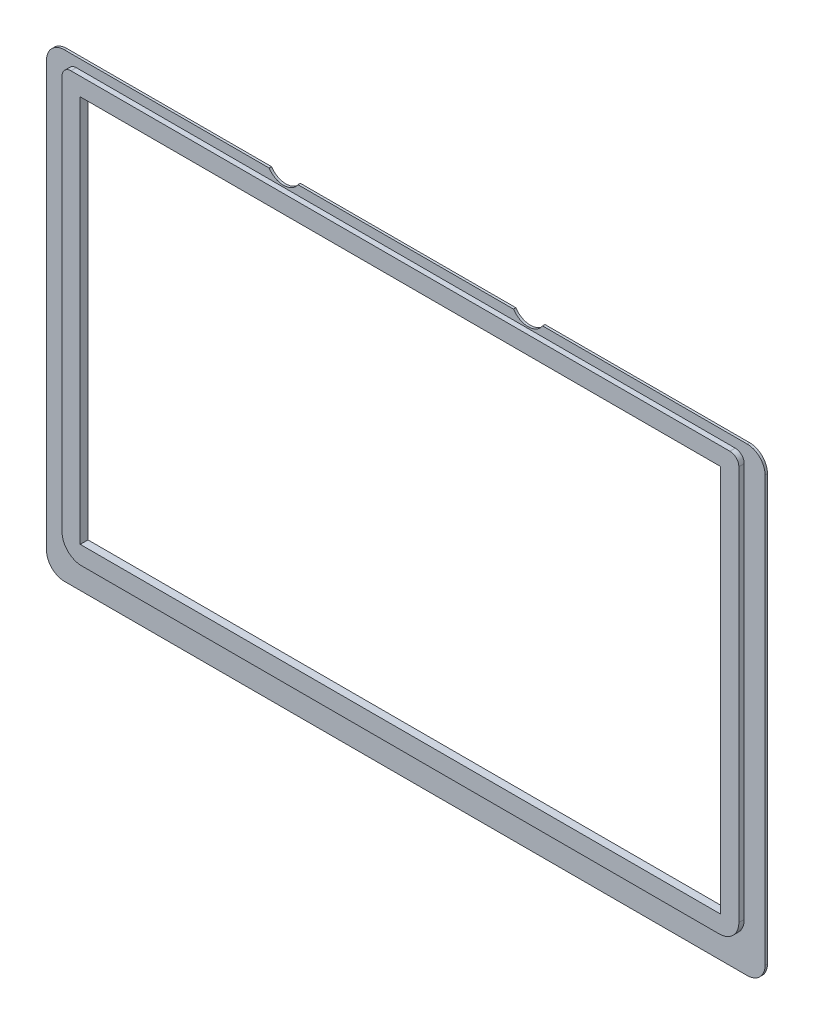
ISO-10303-21;
HEADER;
FILE_DESCRIPTION(('STEP AP214'),'2;1');
FILE_NAME('part.step','',(''),(''),'','','');
FILE_SCHEMA(('AUTOMOTIVE_DESIGN { 1 0 10303 214 1 1 1 1 }'));
ENDSEC;
DATA;
#1=APPLICATION_CONTEXT('core data for automotive mechanical design processes');
#2=APPLICATION_PROTOCOL_DEFINITION('international standard','automotive_design',2000,#1);
#3=PRODUCT_CONTEXT('',#1,'mechanical');
#4=PRODUCT('Part','Part','',(#3));
#5=PRODUCT_RELATED_PRODUCT_CATEGORY('part','',(#4));
#6=PRODUCT_DEFINITION_FORMATION('','',#4);
#7=PRODUCT_DEFINITION_CONTEXT('part definition',#1,'design');
#8=PRODUCT_DEFINITION('design','',#6,#7);
#9=PRODUCT_DEFINITION_SHAPE('','',#8);
#10=(LENGTH_UNIT() NAMED_UNIT(*) SI_UNIT(.MILLI.,.METRE.));
#11=(NAMED_UNIT(*) PLANE_ANGLE_UNIT() SI_UNIT($,.RADIAN.));
#12=(NAMED_UNIT(*) SI_UNIT($,.STERADIAN.) SOLID_ANGLE_UNIT());
#13=UNCERTAINTY_MEASURE_WITH_UNIT(LENGTH_MEASURE(1.E-05),#10,'distance_accuracy_value','');
#14=(GEOMETRIC_REPRESENTATION_CONTEXT(3) GLOBAL_UNCERTAINTY_ASSIGNED_CONTEXT((#13)) GLOBAL_UNIT_ASSIGNED_CONTEXT((#10,
#11,#12)) REPRESENTATION_CONTEXT('',''));
#15=CARTESIAN_POINT('',(0.,0.,0.));
#16=DIRECTION('',(0.,0.,1.));
#17=DIRECTION('',(1.,0.,0.));
#18=AXIS2_PLACEMENT_3D('',#15,#16,#17);
#19=CARTESIAN_POINT('',(60.25,83.5,-124.5086650067));
#20=DIRECTION('',(0.,1.,0.));
#21=DIRECTION('',(0.,0.,1.));
#22=AXIS2_PLACEMENT_3D('',#19,#20,#21);
#23=PLANE('',#22);
#24=DIRECTION('',(0.,0.,1.));
#25=VECTOR('',#24,1.);
#26=CARTESIAN_POINT('',(18.0622953056462,83.5,18.6));
#27=LINE('',#26,#25);
#28=CARTESIAN_POINT('',(18.0622953056462,83.5,18.6));
#29=VERTEX_POINT('',#28);
#30=CARTESIAN_POINT('',(18.0622953056462,83.5,19.));
#31=VERTEX_POINT('',#30);
#32=EDGE_CURVE('E278',#29,#31,#27,.T.);
#33=ORIENTED_EDGE('',*,*,#32,.F.);
#34=DIRECTION('',(1.,0.,0.));
#35=VECTOR('',#34,1.);
#36=CARTESIAN_POINT('',(60.25,83.5,18.6));
#37=LINE('',#36,#35);
#38=CARTESIAN_POINT('',(-18.0813226755104,83.5,18.6));
#39=VERTEX_POINT('',#38);
#40=EDGE_CURVE('E223',#39,#29,#37,.T.);
#41=ORIENTED_EDGE('',*,*,#40,.F.);
#42=DIRECTION('',(0.,0.,1.));
#43=VECTOR('',#42,1.);
#44=CARTESIAN_POINT('',(-18.0813226755104,83.5,18.6));
#45=LINE('',#44,#43);
#46=CARTESIAN_POINT('',(-18.0813226755104,83.5,19.));
#47=VERTEX_POINT('',#46);
#48=EDGE_CURVE('E62',#47,#39,#45,.F.);
#49=ORIENTED_EDGE('',*,*,#48,.F.);
#50=DIRECTION('',(-1.,0.,0.));
#51=VECTOR('',#50,1.);
#52=CARTESIAN_POINT('',(60.25,83.5,19.));
#53=LINE('',#52,#51);
#54=EDGE_CURVE('E249',#31,#47,#53,.T.);
#55=ORIENTED_EDGE('',*,*,#54,.F.);
#56=EDGE_LOOP('',(#33,#41,#49,#55));
#57=FACE_BOUND('',#56,.T.);
#58=ADVANCED_FACE('F39',(#57),#23,.T.);
#59=DIRECTION('',(0.,0.,1.));
#60=VECTOR('',#59,1.);
#61=CARTESIAN_POINT('',(-22.9186773244896,83.5,18.6));
#62=LINE('',#61,#60);
#63=CARTESIAN_POINT('',(-22.9186773244896,83.5,18.6));
#64=VERTEX_POINT('',#63);
#65=CARTESIAN_POINT('',(-22.9186773244896,83.5,19.));
#66=VERTEX_POINT('',#65);
#67=EDGE_CURVE('E200',#64,#66,#62,.T.);
#68=ORIENTED_EDGE('',*,*,#67,.F.);
#69=CARTESIAN_POINT('',(-57.25,83.5,18.6));
#70=VERTEX_POINT('',#69);
#71=EDGE_CURVE('E213',#70,#64,#37,.T.);
#72=ORIENTED_EDGE('',*,*,#71,.F.);
#73=DIRECTION('',(0.,0.,1.));
#74=VECTOR('',#73,1.);
#75=CARTESIAN_POINT('',(-57.25,83.5,-124.5086650067));
#76=LINE('',#75,#74);
#77=CARTESIAN_POINT('',(-57.25,83.5,19.));
#78=VERTEX_POINT('',#77);
#79=EDGE_CURVE('E47',#70,#78,#76,.T.);
#80=ORIENTED_EDGE('',*,*,#79,.T.);
#81=EDGE_CURVE('E215',#66,#78,#53,.T.);
#82=ORIENTED_EDGE('',*,*,#81,.F.);
#83=EDGE_LOOP('',(#68,#72,#80,#82));
#84=FACE_BOUND('',#83,.T.);
#85=ADVANCED_FACE('F211',(#84),#23,.T.);
#86=CARTESIAN_POINT('',(-56.75,10.9,18.6));
#87=DIRECTION('',(-1.,0.,0.));
#88=DIRECTION('',(0.,0.,1.));
#89=AXIS2_PLACEMENT_3D('',#86,#87,#88);
#90=PLANE('',#89);
#91=DIRECTION('',(0.,-1.,0.));
#92=VECTOR('',#91,1.);
#93=CARTESIAN_POINT('',(-56.75,10.9,19.));
#94=LINE('',#93,#92);
#95=CARTESIAN_POINT('',(-56.75,80.4,19.));
#96=VERTEX_POINT('',#95);
#97=CARTESIAN_POINT('',(-56.75,14.2,19.));
#98=VERTEX_POINT('',#97);
#99=EDGE_CURVE('E472',#96,#98,#94,.T.);
#100=ORIENTED_EDGE('',*,*,#99,.T.);
#101=DIRECTION('',(0.,0.,1.));
#102=VECTOR('',#101,1.);
#103=CARTESIAN_POINT('',(-56.75,14.2,18.6));
#104=LINE('',#103,#102);
#105=CARTESIAN_POINT('',(-56.75,14.2,19.9));
#106=VERTEX_POINT('',#105);
#107=EDGE_CURVE('E508',#98,#106,#104,.T.);
#108=ORIENTED_EDGE('',*,*,#107,.T.);
#109=DIRECTION('',(0.,-1.,0.));
#110=VECTOR('',#109,1.);
#111=CARTESIAN_POINT('',(-56.75,10.9,19.9));
#112=LINE('',#111,#110);
#113=CARTESIAN_POINT('',(-56.75,80.4,19.9));
#114=VERTEX_POINT('',#113);
#115=EDGE_CURVE('E468',#114,#106,#112,.T.);
#116=ORIENTED_EDGE('',*,*,#115,.F.);
#117=DIRECTION('',(0.,0.,1.));
#118=VECTOR('',#117,1.);
#119=CARTESIAN_POINT('',(-56.75,80.4,18.6));
#120=LINE('',#119,#118);
#121=EDGE_CURVE('E493',#114,#96,#120,.F.);
#122=ORIENTED_EDGE('',*,*,#121,.T.);
#123=EDGE_LOOP('',(#100,#108,#116,#122));
#124=FACE_BOUND('',#123,.T.);
#125=ADVANCED_FACE('F372',(#124),#90,.T.);
#126=CARTESIAN_POINT('',(56.75,81.9,18.6));
#127=DIRECTION('',(0.,1.,0.));
#128=DIRECTION('',(-1.,0.,0.));
#129=AXIS2_PLACEMENT_3D('',#126,#127,#128);
#130=PLANE('',#129);
#131=DIRECTION('',(-1.,0.,0.));
#132=VECTOR('',#131,1.);
#133=CARTESIAN_POINT('',(56.75,81.9,19.9));
#134=LINE('',#133,#132);
#135=CARTESIAN_POINT('',(55.25,81.9,19.9));
#136=VERTEX_POINT('',#135);
#137=CARTESIAN_POINT('',(-55.25,81.9,19.9));
#138=VERTEX_POINT('',#137);
#139=EDGE_CURVE('E470',#136,#138,#134,.T.);
#140=ORIENTED_EDGE('',*,*,#139,.F.);
#141=DIRECTION('',(0.,0.,1.));
#142=VECTOR('',#141,1.);
#143=CARTESIAN_POINT('',(55.25,81.9,18.6));
#144=LINE('',#143,#142);
#145=CARTESIAN_POINT('',(55.25,81.9,19.));
#146=VERTEX_POINT('',#145);
#147=EDGE_CURVE('E491',#136,#146,#144,.F.);
#148=ORIENTED_EDGE('',*,*,#147,.T.);
#149=DIRECTION('',(-1.,0.,0.));
#150=VECTOR('',#149,1.);
#151=CARTESIAN_POINT('',(56.75,81.9,19.));
#152=LINE('',#151,#150);
#153=CARTESIAN_POINT('',(-55.25,81.9,19.));
#154=VERTEX_POINT('',#153);
#155=EDGE_CURVE('E226',#146,#154,#152,.T.);
#156=ORIENTED_EDGE('',*,*,#155,.T.);
#157=DIRECTION('',(0.,0.,1.));
#158=VECTOR('',#157,1.);
#159=CARTESIAN_POINT('',(-55.25,81.9,18.6));
#160=LINE('',#159,#158);
#161=EDGE_CURVE('E488',#154,#138,#160,.T.);
#162=ORIENTED_EDGE('',*,*,#161,.T.);
#163=EDGE_LOOP('',(#140,#148,#156,#162));
#164=FACE_BOUND('',#163,.T.);
#165=ADVANCED_FACE('F384',(#164),#130,.T.);
#166=CARTESIAN_POINT('',(56.75,10.9,18.6));
#167=DIRECTION('',(1.,0.,0.));
#168=DIRECTION('',(0.,0.,-1.));
#169=AXIS2_PLACEMENT_3D('',#166,#167,#168);
#170=PLANE('',#169);
#171=DIRECTION('',(0.,1.,0.));
#172=VECTOR('',#171,1.);
#173=CARTESIAN_POINT('',(56.75,10.9,19.9));
#174=LINE('',#173,#172);
#175=CARTESIAN_POINT('',(56.75,14.2,19.9));
#176=VERTEX_POINT('',#175);
#177=CARTESIAN_POINT('',(56.75,80.4,19.9));
#178=VERTEX_POINT('',#177);
#179=EDGE_CURVE('E467',#176,#178,#174,.T.);
#180=ORIENTED_EDGE('',*,*,#179,.F.);
#181=DIRECTION('',(0.,0.,1.));
#182=VECTOR('',#181,1.);
#183=CARTESIAN_POINT('',(56.75,14.2,18.6));
#184=LINE('',#183,#182);
#185=CARTESIAN_POINT('',(56.75,14.2,19.));
#186=VERTEX_POINT('',#185);
#187=EDGE_CURVE('E506',#176,#186,#184,.F.);
#188=ORIENTED_EDGE('',*,*,#187,.T.);
#189=DIRECTION('',(0.,1.,0.));
#190=VECTOR('',#189,1.);
#191=CARTESIAN_POINT('',(56.75,10.9,19.));
#192=LINE('',#191,#190);
#193=CARTESIAN_POINT('',(56.75,80.4,19.));
#194=VERTEX_POINT('',#193);
#195=EDGE_CURVE('E222',#186,#194,#192,.T.);
#196=ORIENTED_EDGE('',*,*,#195,.T.);
#197=DIRECTION('',(0.,0.,1.));
#198=VECTOR('',#197,1.);
#199=CARTESIAN_POINT('',(56.75,80.4,18.6));
#200=LINE('',#199,#198);
#201=EDGE_CURVE('E481',#194,#178,#200,.T.);
#202=ORIENTED_EDGE('',*,*,#201,.T.);
#203=EDGE_LOOP('',(#180,#188,#196,#202));
#204=FACE_BOUND('',#203,.T.);
#205=ADVANCED_FACE('F387',(#204),#170,.T.);
#206=CARTESIAN_POINT('',(56.75,10.9,18.6));
#207=DIRECTION('',(0.,-1.,0.));
#208=DIRECTION('',(1.,0.,0.));
#209=AXIS2_PLACEMENT_3D('',#206,#207,#208);
#210=PLANE('',#209);
#211=DIRECTION('',(1.,0.,0.));
#212=VECTOR('',#211,1.);
#213=CARTESIAN_POINT('',(56.75,10.9,19.));
#214=LINE('',#213,#212);
#215=CARTESIAN_POINT('',(-53.45,10.9,19.));
#216=VERTEX_POINT('',#215);
#217=CARTESIAN_POINT('',(53.45,10.9,19.));
#218=VERTEX_POINT('',#217);
#219=EDGE_CURVE('E478',#216,#218,#214,.T.);
#220=ORIENTED_EDGE('',*,*,#219,.T.);
#221=DIRECTION('',(0.,0.,1.));
#222=VECTOR('',#221,1.);
#223=CARTESIAN_POINT('',(53.45,10.9,18.6));
#224=LINE('',#223,#222);
#225=CARTESIAN_POINT('',(53.45,10.9,19.9));
#226=VERTEX_POINT('',#225);
#227=EDGE_CURVE('E502',#218,#226,#224,.T.);
#228=ORIENTED_EDGE('',*,*,#227,.T.);
#229=DIRECTION('',(1.,0.,0.));
#230=VECTOR('',#229,1.);
#231=CARTESIAN_POINT('',(56.75,10.9,19.9));
#232=LINE('',#231,#230);
#233=CARTESIAN_POINT('',(-53.45,10.9,19.9));
#234=VERTEX_POINT('',#233);
#235=EDGE_CURVE('E460',#234,#226,#232,.T.);
#236=ORIENTED_EDGE('',*,*,#235,.F.);
#237=DIRECTION('',(0.,0.,1.));
#238=VECTOR('',#237,1.);
#239=CARTESIAN_POINT('',(-53.45,10.9,18.6));
#240=LINE('',#239,#238);
#241=EDGE_CURVE('E500',#234,#216,#240,.F.);
#242=ORIENTED_EDGE('',*,*,#241,.T.);
#243=EDGE_LOOP('',(#220,#228,#236,#242));
#244=FACE_BOUND('',#243,.T.);
#245=ADVANCED_FACE('F382',(#244),#210,.T.);
#246=CARTESIAN_POINT('',(0.,0.,19.9));
#247=DIRECTION('',(0.,0.,1.));
#248=DIRECTION('',(1.,0.,0.));
#249=AXIS2_PLACEMENT_3D('',#246,#247,#248);
#250=PLANE('',#249);
#251=DIRECTION('',(0.,-1.,0.));
#252=VECTOR('',#251,1.);
#253=CARTESIAN_POINT('',(-53.7,78.9,19.9));
#254=LINE('',#253,#252);
#255=CARTESIAN_POINT('',(-53.7,78.9,19.9));
#256=VERTEX_POINT('',#255);
#257=CARTESIAN_POINT('',(-53.7,13.9,19.9));
#258=VERTEX_POINT('',#257);
#259=EDGE_CURVE('E276',#256,#258,#254,.T.);
#260=ORIENTED_EDGE('',*,*,#259,.F.);
#261=DIRECTION('',(-1.,0.,0.));
#262=VECTOR('',#261,1.);
#263=CARTESIAN_POINT('',(-53.7,78.9,19.9));
#264=LINE('',#263,#262);
#265=CARTESIAN_POINT('',(53.7,78.9,19.9));
#266=VERTEX_POINT('',#265);
#267=EDGE_CURVE('E266',#266,#256,#264,.T.);
#268=ORIENTED_EDGE('',*,*,#267,.F.);
#269=DIRECTION('',(0.,1.,0.));
#270=VECTOR('',#269,1.);
#271=CARTESIAN_POINT('',(53.7,78.9,19.9));
#272=LINE('',#271,#270);
#273=CARTESIAN_POINT('',(53.7,13.9,19.9));
#274=VERTEX_POINT('',#273);
#275=EDGE_CURVE('E270',#274,#266,#272,.T.);
#276=ORIENTED_EDGE('',*,*,#275,.F.);
#277=DIRECTION('',(1.,0.,0.));
#278=VECTOR('',#277,1.);
#279=CARTESIAN_POINT('',(-53.7,13.9,19.9));
#280=LINE('',#279,#278);
#281=EDGE_CURVE('E273',#258,#274,#280,.T.);
#282=ORIENTED_EDGE('',*,*,#281,.F.);
#283=EDGE_LOOP('',(#260,#268,#276,#282));
#284=FACE_BOUND('',#283,.T.);
#285=ORIENTED_EDGE('',*,*,#235,.T.);
#286=CARTESIAN_POINT('',(53.45,14.2,19.9));
#287=DIRECTION('',(0.,0.,1.));
#288=DIRECTION('',(1.,0.,0.));
#289=AXIS2_PLACEMENT_3D('',#286,#287,#288);
#290=CIRCLE('',#289,3.3);
#291=EDGE_CURVE('E461',#226,#176,#290,.T.);
#292=ORIENTED_EDGE('',*,*,#291,.T.);
#293=ORIENTED_EDGE('',*,*,#179,.T.);
#294=CARTESIAN_POINT('',(55.25,80.4,19.9));
#295=DIRECTION('',(0.,0.,1.));
#296=DIRECTION('',(1.,0.,0.));
#297=AXIS2_PLACEMENT_3D('',#294,#295,#296);
#298=CIRCLE('',#297,1.5);
#299=EDGE_CURVE('E486',#178,#136,#298,.T.);
#300=ORIENTED_EDGE('',*,*,#299,.T.);
#301=ORIENTED_EDGE('',*,*,#139,.T.);
#302=CARTESIAN_POINT('',(-55.25,80.4,19.9));
#303=DIRECTION('',(0.,0.,1.));
#304=DIRECTION('',(1.,0.,0.));
#305=AXIS2_PLACEMENT_3D('',#302,#303,#304);
#306=CIRCLE('',#305,1.5);
#307=EDGE_CURVE('E484',#138,#114,#306,.T.);
#308=ORIENTED_EDGE('',*,*,#307,.T.);
#309=ORIENTED_EDGE('',*,*,#115,.T.);
#310=CARTESIAN_POINT('',(-53.45,14.2,19.9));
#311=DIRECTION('',(0.,0.,1.));
#312=DIRECTION('',(1.,0.,0.));
#313=AXIS2_PLACEMENT_3D('',#310,#311,#312);
#314=CIRCLE('',#313,3.3);
#315=EDGE_CURVE('E464',#106,#234,#314,.T.);
#316=ORIENTED_EDGE('',*,*,#315,.T.);
#317=EDGE_LOOP('',(#285,#292,#293,#300,#301,#308,#309,#316));
#318=FACE_BOUND('',#317,.T.);
#319=ADVANCED_FACE('F377',(#284,#318),#250,.T.);
#320=CARTESIAN_POINT('',(60.25,83.5,-124.5086650067));
#321=DIRECTION('',(1.,0.,0.));
#322=DIRECTION('',(0.,1.,0.));
#323=AXIS2_PLACEMENT_3D('',#320,#321,#322);
#324=PLANE('',#323);
#325=DIRECTION('',(0.,1.,0.));
#326=VECTOR('',#325,1.);
#327=CARTESIAN_POINT('',(60.25,83.5,19.));
#328=LINE('',#327,#326);
#329=CARTESIAN_POINT('',(60.25,9.29999999999999,19.));
#330=VERTEX_POINT('',#329);
#331=CARTESIAN_POINT('',(60.25,80.5,19.));
#332=VERTEX_POINT('',#331);
#333=EDGE_CURVE('E241',#330,#332,#328,.T.);
#334=ORIENTED_EDGE('',*,*,#333,.F.);
#335=DIRECTION('',(0.,0.,1.));
#336=VECTOR('',#335,1.);
#337=CARTESIAN_POINT('',(60.25,9.29999999999999,-124.5086650067));
#338=LINE('',#337,#336);
#339=CARTESIAN_POINT('',(60.25,9.29999999999999,18.6));
#340=VERTEX_POINT('',#339);
#341=EDGE_CURVE('E318',#330,#340,#338,.F.);
#342=ORIENTED_EDGE('',*,*,#341,.T.);
#343=DIRECTION('',(0.,-1.,0.));
#344=VECTOR('',#343,1.);
#345=CARTESIAN_POINT('',(60.25,83.5,18.6));
#346=LINE('',#345,#344);
#347=CARTESIAN_POINT('',(60.25,80.5,18.6));
#348=VERTEX_POINT('',#347);
#349=EDGE_CURVE('E229',#348,#340,#346,.T.);
#350=ORIENTED_EDGE('',*,*,#349,.F.);
#351=DIRECTION('',(0.,0.,1.));
#352=VECTOR('',#351,1.);
#353=CARTESIAN_POINT('',(60.25,80.5,-124.5086650067));
#354=LINE('',#353,#352);
#355=EDGE_CURVE('E307',#348,#332,#354,.T.);
#356=ORIENTED_EDGE('',*,*,#355,.T.);
#357=EDGE_LOOP('',(#334,#342,#350,#356));
#358=FACE_BOUND('',#357,.T.);
#359=ADVANCED_FACE('F375',(#358),#324,.T.);
#360=CARTESIAN_POINT('',(60.25,6.29999999999999,-124.5086650067));
#361=DIRECTION('',(0.,-1.,0.));
#362=DIRECTION('',(0.,0.,-1.));
#363=AXIS2_PLACEMENT_3D('',#360,#361,#362);
#364=PLANE('',#363);
#365=DIRECTION('',(1.,0.,0.));
#366=VECTOR('',#365,1.);
#367=CARTESIAN_POINT('',(60.25,6.29999999999999,19.));
#368=LINE('',#367,#366);
#369=CARTESIAN_POINT('',(-57.25,6.29999999999999,19.));
#370=VERTEX_POINT('',#369);
#371=CARTESIAN_POINT('',(57.25,6.29999999999999,19.));
#372=VERTEX_POINT('',#371);
#373=EDGE_CURVE('E251',#370,#372,#368,.T.);
#374=ORIENTED_EDGE('',*,*,#373,.F.);
#375=DIRECTION('',(0.,0.,1.));
#376=VECTOR('',#375,1.);
#377=CARTESIAN_POINT('',(-57.25,6.29999999999999,-124.5086650067));
#378=LINE('',#377,#376);
#379=CARTESIAN_POINT('',(-57.25,6.29999999999999,18.6));
#380=VERTEX_POINT('',#379);
#381=EDGE_CURVE('E312',#370,#380,#378,.F.);
#382=ORIENTED_EDGE('',*,*,#381,.T.);
#383=DIRECTION('',(-1.,0.,0.));
#384=VECTOR('',#383,1.);
#385=CARTESIAN_POINT('',(60.25,6.29999999999999,18.6));
#386=LINE('',#385,#384);
#387=CARTESIAN_POINT('',(57.25,6.29999999999999,18.6));
#388=VERTEX_POINT('',#387);
#389=EDGE_CURVE('E232',#388,#380,#386,.T.);
#390=ORIENTED_EDGE('',*,*,#389,.F.);
#391=DIRECTION('',(0.,0.,1.));
#392=VECTOR('',#391,1.);
#393=CARTESIAN_POINT('',(57.25,6.29999999999999,-124.5086650067));
#394=LINE('',#393,#392);
#395=EDGE_CURVE('E337',#388,#372,#394,.T.);
#396=ORIENTED_EDGE('',*,*,#395,.T.);
#397=EDGE_LOOP('',(#374,#382,#390,#396));
#398=FACE_BOUND('',#397,.T.);
#399=ADVANCED_FACE('F342',(#398),#364,.T.);
#400=CARTESIAN_POINT('',(-60.25,83.5,-124.5086650067));
#401=DIRECTION('',(-1.,0.,0.));
#402=DIRECTION('',(0.,-1.,0.));
#403=AXIS2_PLACEMENT_3D('',#400,#401,#402);
#404=PLANE('',#403);
#405=DIRECTION('',(0.,1.,0.));
#406=VECTOR('',#405,1.);
#407=CARTESIAN_POINT('',(-60.25,83.5,18.6));
#408=LINE('',#407,#406);
#409=CARTESIAN_POINT('',(-60.25,9.29999999999999,18.6));
#410=VERTEX_POINT('',#409);
#411=CARTESIAN_POINT('',(-60.25,80.5,18.6));
#412=VERTEX_POINT('',#411);
#413=EDGE_CURVE('E237',#410,#412,#408,.T.);
#414=ORIENTED_EDGE('',*,*,#413,.F.);
#415=DIRECTION('',(0.,0.,1.));
#416=VECTOR('',#415,1.);
#417=CARTESIAN_POINT('',(-60.25,9.29999999999999,-124.5086650067));
#418=LINE('',#417,#416);
#419=CARTESIAN_POINT('',(-60.25,9.29999999999999,19.));
#420=VERTEX_POINT('',#419);
#421=EDGE_CURVE('E326',#410,#420,#418,.T.);
#422=ORIENTED_EDGE('',*,*,#421,.T.);
#423=DIRECTION('',(0.,-1.,0.));
#424=VECTOR('',#423,1.);
#425=CARTESIAN_POINT('',(-60.25,83.5,19.));
#426=LINE('',#425,#424);
#427=CARTESIAN_POINT('',(-60.25,80.5,19.));
#428=VERTEX_POINT('',#427);
#429=EDGE_CURVE('E248',#428,#420,#426,.T.);
#430=ORIENTED_EDGE('',*,*,#429,.F.);
#431=DIRECTION('',(0.,0.,1.));
#432=VECTOR('',#431,1.);
#433=CARTESIAN_POINT('',(-60.25,80.5,-124.5086650067));
#434=LINE('',#433,#432);
#435=EDGE_CURVE('E323',#428,#412,#434,.F.);
#436=ORIENTED_EDGE('',*,*,#435,.T.);
#437=EDGE_LOOP('',(#414,#422,#430,#436));
#438=FACE_BOUND('',#437,.T.);
#439=ADVANCED_FACE('F349',(#438),#404,.T.);
#440=DIRECTION('',(0.,0.,1.));
#441=VECTOR('',#440,1.);
#442=CARTESIAN_POINT('',(22.9377046943538,83.5,18.6));
#443=LINE('',#442,#441);
#444=CARTESIAN_POINT('',(22.9377046943538,83.5,19.));
#445=VERTEX_POINT('',#444);
#446=CARTESIAN_POINT('',(22.9377046943538,83.5,18.6));
#447=VERTEX_POINT('',#446);
#448=EDGE_CURVE('E54',#445,#447,#443,.F.);
#449=ORIENTED_EDGE('',*,*,#448,.F.);
#450=CARTESIAN_POINT('',(57.25,83.5,19.));
#451=VERTEX_POINT('',#450);
#452=EDGE_CURVE('E245',#451,#445,#53,.T.);
#453=ORIENTED_EDGE('',*,*,#452,.F.);
#454=DIRECTION('',(0.,0.,1.));
#455=VECTOR('',#454,1.);
#456=CARTESIAN_POINT('',(57.25,83.5,-124.5086650067));
#457=LINE('',#456,#455);
#458=CARTESIAN_POINT('',(57.25,83.5,18.6));
#459=VERTEX_POINT('',#458);
#460=EDGE_CURVE('E11',#451,#459,#457,.F.);
#461=ORIENTED_EDGE('',*,*,#460,.T.);
#462=EDGE_CURVE('E225',#447,#459,#37,.T.);
#463=ORIENTED_EDGE('',*,*,#462,.F.);
#464=EDGE_LOOP('',(#449,#453,#461,#463));
#465=FACE_BOUND('',#464,.T.);
#466=ADVANCED_FACE('F298',(#465),#23,.T.);
#467=CARTESIAN_POINT('',(0.,0.,19.));
#468=DIRECTION('',(0.,0.,-1.));
#469=DIRECTION('',(-1.,0.,0.));
#470=AXIS2_PLACEMENT_3D('',#467,#468,#469);
#471=PLANE('',#470);
#472=ORIENTED_EDGE('',*,*,#99,.F.);
#473=CARTESIAN_POINT('',(-55.25,80.4,19.));
#474=DIRECTION('',(0.,0.,-1.));
#475=DIRECTION('',(-1.,0.,0.));
#476=AXIS2_PLACEMENT_3D('',#473,#474,#475);
#477=CIRCLE('',#476,1.5);
#478=EDGE_CURVE('E498',#96,#154,#477,.T.);
#479=ORIENTED_EDGE('',*,*,#478,.T.);
#480=ORIENTED_EDGE('',*,*,#155,.F.);
#481=CARTESIAN_POINT('',(55.25,80.4,19.));
#482=DIRECTION('',(0.,0.,-1.));
#483=DIRECTION('',(-1.,0.,0.));
#484=AXIS2_PLACEMENT_3D('',#481,#482,#483);
#485=CIRCLE('',#484,1.5);
#486=EDGE_CURVE('E495',#146,#194,#485,.T.);
#487=ORIENTED_EDGE('',*,*,#486,.T.);
#488=ORIENTED_EDGE('',*,*,#195,.F.);
#489=CARTESIAN_POINT('',(53.45,14.2,19.));
#490=DIRECTION('',(0.,0.,-1.));
#491=DIRECTION('',(-1.,0.,0.));
#492=AXIS2_PLACEMENT_3D('',#489,#490,#491);
#493=CIRCLE('',#492,3.3);
#494=EDGE_CURVE('E511',#186,#218,#493,.T.);
#495=ORIENTED_EDGE('',*,*,#494,.T.);
#496=ORIENTED_EDGE('',*,*,#219,.F.);
#497=CARTESIAN_POINT('',(-53.45,14.2,19.));
#498=DIRECTION('',(0.,0.,-1.));
#499=DIRECTION('',(-1.,0.,0.));
#500=AXIS2_PLACEMENT_3D('',#497,#498,#499);
#501=CIRCLE('',#500,3.3);
#502=EDGE_CURVE('E513',#216,#98,#501,.T.);
#503=ORIENTED_EDGE('',*,*,#502,.T.);
#504=EDGE_LOOP('',(#472,#479,#480,#487,#488,#495,#496,#503));
#505=FACE_BOUND('',#504,.T.);
#506=ORIENTED_EDGE('',*,*,#452,.T.);
#507=CARTESIAN_POINT('',(20.5,85.0708583077813,19.));
#508=DIRECTION('',(0.,0.,-1.));
#509=DIRECTION('',(-1.,0.,0.));
#510=AXIS2_PLACEMENT_3D('',#507,#508,#509);
#511=CIRCLE('',#510,2.9);
#512=EDGE_CURVE('E216',#445,#31,#511,.T.);
#513=ORIENTED_EDGE('',*,*,#512,.T.);
#514=ORIENTED_EDGE('',*,*,#54,.T.);
#515=CARTESIAN_POINT('',(-20.5,85.1,19.));
#516=DIRECTION('',(0.,0.,-1.));
#517=DIRECTION('',(-1.,0.,0.));
#518=AXIS2_PLACEMENT_3D('',#515,#516,#517);
#519=CIRCLE('',#518,2.9);
#520=EDGE_CURVE('E294',#47,#66,#519,.T.);
#521=ORIENTED_EDGE('',*,*,#520,.T.);
#522=ORIENTED_EDGE('',*,*,#81,.T.);
#523=CARTESIAN_POINT('',(-57.25,80.5,19.));
#524=DIRECTION('',(0.,0.,-1.));
#525=DIRECTION('',(-1.,0.,0.));
#526=AXIS2_PLACEMENT_3D('',#523,#524,#525);
#527=CIRCLE('',#526,3.);
#528=EDGE_CURVE('E322',#78,#428,#527,.F.);
#529=ORIENTED_EDGE('',*,*,#528,.T.);
#530=ORIENTED_EDGE('',*,*,#429,.T.);
#531=CARTESIAN_POINT('',(-57.25,9.29999999999999,19.));
#532=DIRECTION('',(0.,0.,-1.));
#533=DIRECTION('',(-1.,0.,0.));
#534=AXIS2_PLACEMENT_3D('',#531,#532,#533);
#535=CIRCLE('',#534,3.);
#536=EDGE_CURVE('E335',#420,#370,#535,.F.);
#537=ORIENTED_EDGE('',*,*,#536,.T.);
#538=ORIENTED_EDGE('',*,*,#373,.T.);
#539=CARTESIAN_POINT('',(57.25,9.29999999999999,19.));
#540=DIRECTION('',(0.,0.,-1.));
#541=DIRECTION('',(-1.,0.,0.));
#542=AXIS2_PLACEMENT_3D('',#539,#540,#541);
#543=CIRCLE('',#542,3.);
#544=EDGE_CURVE('E328',#372,#330,#543,.F.);
#545=ORIENTED_EDGE('',*,*,#544,.T.);
#546=ORIENTED_EDGE('',*,*,#333,.T.);
#547=CARTESIAN_POINT('',(57.25,80.5,19.));
#548=DIRECTION('',(0.,0.,-1.));
#549=DIRECTION('',(-1.,0.,0.));
#550=AXIS2_PLACEMENT_3D('',#547,#548,#549);
#551=CIRCLE('',#550,3.);
#552=EDGE_CURVE('E325',#332,#451,#551,.F.);
#553=ORIENTED_EDGE('',*,*,#552,.T.);
#554=EDGE_LOOP('',(#506,#513,#514,#521,#522,#529,#530,#537,#538,#545,#546,#553));
#555=FACE_BOUND('',#554,.T.);
#556=ADVANCED_FACE('F350',(#505,#555),#471,.F.);
#557=CARTESIAN_POINT('',(0.,0.,18.6));
#558=DIRECTION('',(0.,0.,1.));
#559=DIRECTION('',(1.,0.,0.));
#560=AXIS2_PLACEMENT_3D('',#557,#558,#559);
#561=PLANE('',#560);
#562=DIRECTION('',(-1.,0.,0.));
#563=VECTOR('',#562,1.);
#564=CARTESIAN_POINT('',(-53.7,78.9,18.6));
#565=LINE('',#564,#563);
#566=CARTESIAN_POINT('',(53.7,78.9,18.6));
#567=VERTEX_POINT('',#566);
#568=CARTESIAN_POINT('',(-53.7,78.9,18.6));
#569=VERTEX_POINT('',#568);
#570=EDGE_CURVE('E261',#567,#569,#565,.T.);
#571=ORIENTED_EDGE('',*,*,#570,.T.);
#572=DIRECTION('',(0.,-1.,0.));
#573=VECTOR('',#572,1.);
#574=CARTESIAN_POINT('',(-53.7,78.9,18.6));
#575=LINE('',#574,#573);
#576=CARTESIAN_POINT('',(-53.7,13.9,18.6));
#577=VERTEX_POINT('',#576);
#578=EDGE_CURVE('E269',#569,#577,#575,.T.);
#579=ORIENTED_EDGE('',*,*,#578,.T.);
#580=DIRECTION('',(1.,0.,0.));
#581=VECTOR('',#580,1.);
#582=CARTESIAN_POINT('',(-53.7,13.9,18.6));
#583=LINE('',#582,#581);
#584=CARTESIAN_POINT('',(53.7,13.9,18.6));
#585=VERTEX_POINT('',#584);
#586=EDGE_CURVE('E284',#577,#585,#583,.T.);
#587=ORIENTED_EDGE('',*,*,#586,.T.);
#588=DIRECTION('',(0.,1.,0.));
#589=VECTOR('',#588,1.);
#590=CARTESIAN_POINT('',(53.7,78.9,18.6));
#591=LINE('',#590,#589);
#592=EDGE_CURVE('E281',#585,#567,#591,.T.);
#593=ORIENTED_EDGE('',*,*,#592,.T.);
#594=EDGE_LOOP('',(#571,#579,#587,#593));
#595=FACE_BOUND('',#594,.T.);
#596=ORIENTED_EDGE('',*,*,#40,.T.);
#597=CARTESIAN_POINT('',(20.5,85.0708583077813,18.6));
#598=DIRECTION('',(0.,0.,1.));
#599=DIRECTION('',(1.,0.,0.));
#600=AXIS2_PLACEMENT_3D('',#597,#598,#599);
#601=CIRCLE('',#600,2.9);
#602=EDGE_CURVE('E206',#29,#447,#601,.T.);
#603=ORIENTED_EDGE('',*,*,#602,.T.);
#604=ORIENTED_EDGE('',*,*,#462,.T.);
#605=CARTESIAN_POINT('',(57.25,80.5,18.6));
#606=DIRECTION('',(0.,0.,1.));
#607=DIRECTION('',(1.,0.,0.));
#608=AXIS2_PLACEMENT_3D('',#605,#606,#607);
#609=CIRCLE('',#608,3.);
#610=EDGE_CURVE('E304',#459,#348,#609,.F.);
#611=ORIENTED_EDGE('',*,*,#610,.T.);
#612=ORIENTED_EDGE('',*,*,#349,.T.);
#613=CARTESIAN_POINT('',(57.25,9.29999999999999,18.6));
#614=DIRECTION('',(0.,0.,1.));
#615=DIRECTION('',(1.,0.,0.));
#616=AXIS2_PLACEMENT_3D('',#613,#614,#615);
#617=CIRCLE('',#616,3.);
#618=EDGE_CURVE('E308',#340,#388,#617,.F.);
#619=ORIENTED_EDGE('',*,*,#618,.T.);
#620=ORIENTED_EDGE('',*,*,#389,.T.);
#621=CARTESIAN_POINT('',(-57.25,9.29999999999999,18.6));
#622=DIRECTION('',(0.,0.,1.));
#623=DIRECTION('',(1.,0.,0.));
#624=AXIS2_PLACEMENT_3D('',#621,#622,#623);
#625=CIRCLE('',#624,3.);
#626=EDGE_CURVE('E310',#380,#410,#625,.F.);
#627=ORIENTED_EDGE('',*,*,#626,.T.);
#628=ORIENTED_EDGE('',*,*,#413,.T.);
#629=CARTESIAN_POINT('',(-57.25,80.5,18.6));
#630=DIRECTION('',(0.,0.,1.));
#631=DIRECTION('',(1.,0.,0.));
#632=AXIS2_PLACEMENT_3D('',#629,#630,#631);
#633=CIRCLE('',#632,3.);
#634=EDGE_CURVE('E221',#412,#70,#633,.F.);
#635=ORIENTED_EDGE('',*,*,#634,.T.);
#636=ORIENTED_EDGE('',*,*,#71,.T.);
#637=CARTESIAN_POINT('',(-20.5,85.1,18.6));
#638=DIRECTION('',(0.,0.,1.));
#639=DIRECTION('',(1.,0.,0.));
#640=AXIS2_PLACEMENT_3D('',#637,#638,#639);
#641=CIRCLE('',#640,2.9);
#642=EDGE_CURVE('E197',#64,#39,#641,.T.);
#643=ORIENTED_EDGE('',*,*,#642,.T.);
#644=EDGE_LOOP('',(#596,#603,#604,#611,#612,#619,#620,#627,#628,#635,#636,#643));
#645=FACE_BOUND('',#644,.T.);
#646=ADVANCED_FACE('F218',(#595,#645),#561,.F.);
#647=CARTESIAN_POINT('',(-53.7,78.9,18.6));
#648=DIRECTION('',(-1.,0.,0.));
#649=DIRECTION('',(0.,0.,1.));
#650=AXIS2_PLACEMENT_3D('',#647,#648,#649);
#651=PLANE('',#650);
#652=ORIENTED_EDGE('',*,*,#259,.T.);
#653=DIRECTION('',(0.,0.,1.));
#654=VECTOR('',#653,1.);
#655=CARTESIAN_POINT('',(-53.7,13.9,18.6));
#656=LINE('',#655,#654);
#657=EDGE_CURVE('E257',#577,#258,#656,.T.);
#658=ORIENTED_EDGE('',*,*,#657,.F.);
#659=ORIENTED_EDGE('',*,*,#578,.F.);
#660=DIRECTION('',(0.,0.,1.));
#661=VECTOR('',#660,1.);
#662=CARTESIAN_POINT('',(-53.7,78.9,18.6));
#663=LINE('',#662,#661);
#664=EDGE_CURVE('E244',#569,#256,#663,.T.);
#665=ORIENTED_EDGE('',*,*,#664,.T.);
#666=EDGE_LOOP('',(#652,#658,#659,#665));
#667=FACE_BOUND('',#666,.T.);
#668=ADVANCED_FACE('F357',(#667),#651,.F.);
#669=CARTESIAN_POINT('',(-53.7,78.9,18.6));
#670=DIRECTION('',(0.,1.,0.));
#671=DIRECTION('',(0.,0.,1.));
#672=AXIS2_PLACEMENT_3D('',#669,#670,#671);
#673=PLANE('',#672);
#674=ORIENTED_EDGE('',*,*,#267,.T.);
#675=ORIENTED_EDGE('',*,*,#664,.F.);
#676=ORIENTED_EDGE('',*,*,#570,.F.);
#677=DIRECTION('',(0.,0.,1.));
#678=VECTOR('',#677,1.);
#679=CARTESIAN_POINT('',(53.7,78.9,18.6));
#680=LINE('',#679,#678);
#681=EDGE_CURVE('E263',#567,#266,#680,.T.);
#682=ORIENTED_EDGE('',*,*,#681,.T.);
#683=EDGE_LOOP('',(#674,#675,#676,#682));
#684=FACE_BOUND('',#683,.T.);
#685=ADVANCED_FACE('F434',(#684),#673,.F.);
#686=CARTESIAN_POINT('',(53.7,78.9,18.6));
#687=DIRECTION('',(1.,0.,0.));
#688=DIRECTION('',(0.,0.,-1.));
#689=AXIS2_PLACEMENT_3D('',#686,#687,#688);
#690=PLANE('',#689);
#691=ORIENTED_EDGE('',*,*,#275,.T.);
#692=ORIENTED_EDGE('',*,*,#681,.F.);
#693=ORIENTED_EDGE('',*,*,#592,.F.);
#694=DIRECTION('',(0.,0.,1.));
#695=VECTOR('',#694,1.);
#696=CARTESIAN_POINT('',(53.7,13.9,18.6));
#697=LINE('',#696,#695);
#698=EDGE_CURVE('E260',#585,#274,#697,.T.);
#699=ORIENTED_EDGE('',*,*,#698,.T.);
#700=EDGE_LOOP('',(#691,#692,#693,#699));
#701=FACE_BOUND('',#700,.T.);
#702=ADVANCED_FACE('F437',(#701),#690,.F.);
#703=CARTESIAN_POINT('',(-53.7,13.9,18.6));
#704=DIRECTION('',(0.,-1.,0.));
#705=DIRECTION('',(1.,0.,0.));
#706=AXIS2_PLACEMENT_3D('',#703,#704,#705);
#707=PLANE('',#706);
#708=ORIENTED_EDGE('',*,*,#281,.T.);
#709=ORIENTED_EDGE('',*,*,#698,.F.);
#710=ORIENTED_EDGE('',*,*,#586,.F.);
#711=ORIENTED_EDGE('',*,*,#657,.T.);
#712=EDGE_LOOP('',(#708,#709,#710,#711));
#713=FACE_BOUND('',#712,.T.);
#714=ADVANCED_FACE('F402',(#713),#707,.F.);
#715=CARTESIAN_POINT('',(55.25,80.4,18.6));
#716=DIRECTION('',(0.,0.,1.));
#717=DIRECTION('',(1.,0.,0.));
#718=AXIS2_PLACEMENT_3D('',#715,#716,#717);
#719=CYLINDRICAL_SURFACE('',#718,1.5);
#720=ORIENTED_EDGE('',*,*,#486,.F.);
#721=ORIENTED_EDGE('',*,*,#147,.F.);
#722=ORIENTED_EDGE('',*,*,#299,.F.);
#723=ORIENTED_EDGE('',*,*,#201,.F.);
#724=EDGE_LOOP('',(#720,#721,#722,#723));
#725=FACE_BOUND('',#724,.T.);
#726=ADVANCED_FACE('F398',(#725),#719,.T.);
#727=CARTESIAN_POINT('',(-55.25,80.4,18.6));
#728=DIRECTION('',(0.,0.,1.));
#729=DIRECTION('',(1.,0.,0.));
#730=AXIS2_PLACEMENT_3D('',#727,#728,#729);
#731=CYLINDRICAL_SURFACE('',#730,1.5);
#732=ORIENTED_EDGE('',*,*,#478,.F.);
#733=ORIENTED_EDGE('',*,*,#121,.F.);
#734=ORIENTED_EDGE('',*,*,#307,.F.);
#735=ORIENTED_EDGE('',*,*,#161,.F.);
#736=EDGE_LOOP('',(#732,#733,#734,#735));
#737=FACE_BOUND('',#736,.T.);
#738=ADVANCED_FACE('F401',(#737),#731,.T.);
#739=CARTESIAN_POINT('',(53.45,14.2,18.6));
#740=DIRECTION('',(0.,0.,1.));
#741=DIRECTION('',(1.,0.,0.));
#742=AXIS2_PLACEMENT_3D('',#739,#740,#741);
#743=CYLINDRICAL_SURFACE('',#742,3.3);
#744=ORIENTED_EDGE('',*,*,#494,.F.);
#745=ORIENTED_EDGE('',*,*,#187,.F.);
#746=ORIENTED_EDGE('',*,*,#291,.F.);
#747=ORIENTED_EDGE('',*,*,#227,.F.);
#748=EDGE_LOOP('',(#744,#745,#746,#747));
#749=FACE_BOUND('',#748,.T.);
#750=ADVANCED_FACE('F406',(#749),#743,.T.);
#751=CARTESIAN_POINT('',(-53.45,14.2,18.6));
#752=DIRECTION('',(0.,0.,1.));
#753=DIRECTION('',(1.,0.,0.));
#754=AXIS2_PLACEMENT_3D('',#751,#752,#753);
#755=CYLINDRICAL_SURFACE('',#754,3.3);
#756=ORIENTED_EDGE('',*,*,#502,.F.);
#757=ORIENTED_EDGE('',*,*,#241,.F.);
#758=ORIENTED_EDGE('',*,*,#315,.F.);
#759=ORIENTED_EDGE('',*,*,#107,.F.);
#760=EDGE_LOOP('',(#756,#757,#758,#759));
#761=FACE_BOUND('',#760,.T.);
#762=ADVANCED_FACE('F410',(#761),#755,.T.);
#763=CARTESIAN_POINT('',(-57.25,9.29999999999999,-124.5086650067));
#764=DIRECTION('',(0.,0.,1.));
#765=DIRECTION('',(1.,0.,0.));
#766=AXIS2_PLACEMENT_3D('',#763,#764,#765);
#767=CYLINDRICAL_SURFACE('',#766,3.);
#768=ORIENTED_EDGE('',*,*,#626,.F.);
#769=ORIENTED_EDGE('',*,*,#381,.F.);
#770=ORIENTED_EDGE('',*,*,#536,.F.);
#771=ORIENTED_EDGE('',*,*,#421,.F.);
#772=EDGE_LOOP('',(#768,#769,#770,#771));
#773=FACE_BOUND('',#772,.T.);
#774=ADVANCED_FACE('F347',(#773),#767,.T.);
#775=CARTESIAN_POINT('',(57.25,9.29999999999999,-124.5086650067));
#776=DIRECTION('',(0.,0.,1.));
#777=DIRECTION('',(1.,0.,0.));
#778=AXIS2_PLACEMENT_3D('',#775,#776,#777);
#779=CYLINDRICAL_SURFACE('',#778,3.);
#780=ORIENTED_EDGE('',*,*,#618,.F.);
#781=ORIENTED_EDGE('',*,*,#341,.F.);
#782=ORIENTED_EDGE('',*,*,#544,.F.);
#783=ORIENTED_EDGE('',*,*,#395,.F.);
#784=EDGE_LOOP('',(#780,#781,#782,#783));
#785=FACE_BOUND('',#784,.T.);
#786=ADVANCED_FACE('F417',(#785),#779,.T.);
#787=CARTESIAN_POINT('',(57.25,80.5,-124.5086650067));
#788=DIRECTION('',(0.,0.,1.));
#789=DIRECTION('',(1.,0.,0.));
#790=AXIS2_PLACEMENT_3D('',#787,#788,#789);
#791=CYLINDRICAL_SURFACE('',#790,3.);
#792=ORIENTED_EDGE('',*,*,#610,.F.);
#793=ORIENTED_EDGE('',*,*,#460,.F.);
#794=ORIENTED_EDGE('',*,*,#552,.F.);
#795=ORIENTED_EDGE('',*,*,#355,.F.);
#796=EDGE_LOOP('',(#792,#793,#794,#795));
#797=FACE_BOUND('',#796,.T.);
#798=ADVANCED_FACE('F305',(#797),#791,.T.);
#799=CARTESIAN_POINT('',(-57.25,80.5,-124.5086650067));
#800=DIRECTION('',(0.,0.,1.));
#801=DIRECTION('',(1.,0.,0.));
#802=AXIS2_PLACEMENT_3D('',#799,#800,#801);
#803=CYLINDRICAL_SURFACE('',#802,3.);
#804=ORIENTED_EDGE('',*,*,#634,.F.);
#805=ORIENTED_EDGE('',*,*,#435,.F.);
#806=ORIENTED_EDGE('',*,*,#528,.F.);
#807=ORIENTED_EDGE('',*,*,#79,.F.);
#808=EDGE_LOOP('',(#804,#805,#806,#807));
#809=FACE_BOUND('',#808,.T.);
#810=ADVANCED_FACE('F41',(#809),#803,.T.);
#811=CARTESIAN_POINT('',(-20.5,85.1,18.6));
#812=DIRECTION('',(0.,0.,1.));
#813=DIRECTION('',(1.,0.,0.));
#814=AXIS2_PLACEMENT_3D('',#811,#812,#813);
#815=CYLINDRICAL_SURFACE('',#814,2.9);
#816=ORIENTED_EDGE('',*,*,#67,.T.);
#817=ORIENTED_EDGE('',*,*,#520,.F.);
#818=ORIENTED_EDGE('',*,*,#48,.T.);
#819=ORIENTED_EDGE('',*,*,#642,.F.);
#820=EDGE_LOOP('',(#816,#817,#818,#819));
#821=FACE_BOUND('',#820,.T.);
#822=ADVANCED_FACE('F199',(#821),#815,.F.);
#823=CARTESIAN_POINT('',(20.5,85.0708583077813,18.6));
#824=DIRECTION('',(0.,0.,1.));
#825=DIRECTION('',(1.,0.,0.));
#826=AXIS2_PLACEMENT_3D('',#823,#824,#825);
#827=CYLINDRICAL_SURFACE('',#826,2.9);
#828=ORIENTED_EDGE('',*,*,#32,.T.);
#829=ORIENTED_EDGE('',*,*,#512,.F.);
#830=ORIENTED_EDGE('',*,*,#448,.T.);
#831=ORIENTED_EDGE('',*,*,#602,.F.);
#832=EDGE_LOOP('',(#828,#829,#830,#831));
#833=FACE_BOUND('',#832,.T.);
#834=ADVANCED_FACE('F427',(#833),#827,.F.);
#835=CLOSED_SHELL('',(#58,#85,#125,#165,#205,#245,#319,#359,#399,#439,#466,#556,#646,#668,#685,
#702,#714,#726,#738,#750,#762,#774,#786,#798,#810,#822,#834));
#836=MANIFOLD_SOLID_BREP('B2',#835);
#837=ADVANCED_BREP_SHAPE_REPRESENTATION('',(#18,#836),#14);
#838=SHAPE_DEFINITION_REPRESENTATION(#9,#837);
ENDSEC;
END-ISO-10303-21;
